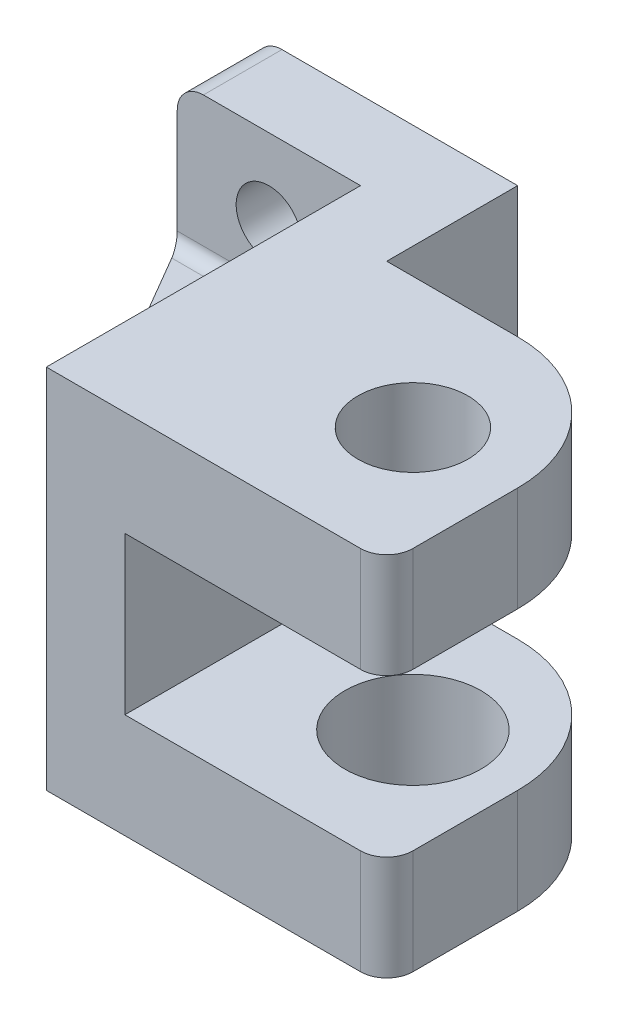
ISO-10303-21;
HEADER;
FILE_DESCRIPTION(('STEP AP214'),'2;1');
FILE_NAME('part.step','',(''),(''),'','','');
FILE_SCHEMA(('AUTOMOTIVE_DESIGN { 1 0 10303 214 1 1 1 1 }'));
ENDSEC;
DATA;
#1=APPLICATION_CONTEXT('core data for automotive mechanical design processes');
#2=APPLICATION_PROTOCOL_DEFINITION('international standard','automotive_design',2000,#1);
#3=PRODUCT_CONTEXT('',#1,'mechanical');
#4=PRODUCT('Part','Part','',(#3));
#5=PRODUCT_RELATED_PRODUCT_CATEGORY('part','',(#4));
#6=PRODUCT_DEFINITION_FORMATION('','',#4);
#7=PRODUCT_DEFINITION_CONTEXT('part definition',#1,'design');
#8=PRODUCT_DEFINITION('design','',#6,#7);
#9=PRODUCT_DEFINITION_SHAPE('','',#8);
#10=(LENGTH_UNIT() NAMED_UNIT(*) SI_UNIT(.MILLI.,.METRE.));
#11=(NAMED_UNIT(*) PLANE_ANGLE_UNIT() SI_UNIT($,.RADIAN.));
#12=(NAMED_UNIT(*) SI_UNIT($,.STERADIAN.) SOLID_ANGLE_UNIT());
#13=UNCERTAINTY_MEASURE_WITH_UNIT(LENGTH_MEASURE(1.E-05),#10,'distance_accuracy_value','');
#14=(GEOMETRIC_REPRESENTATION_CONTEXT(3) GLOBAL_UNCERTAINTY_ASSIGNED_CONTEXT((#13)) GLOBAL_UNIT_ASSIGNED_CONTEXT((#10,
#11,#12)) REPRESENTATION_CONTEXT('',''));
#15=CARTESIAN_POINT('',(0.,0.,0.));
#16=DIRECTION('',(0.,0.,1.));
#17=DIRECTION('',(1.,0.,0.));
#18=AXIS2_PLACEMENT_3D('',#15,#16,#17);
#19=CARTESIAN_POINT('',(-5.,7.,3.));
#20=DIRECTION('',(0.,-1.,0.));
#21=DIRECTION('',(0.,0.,-1.));
#22=AXIS2_PLACEMENT_3D('',#19,#20,#21);
#23=PLANE('',#22);
#24=DIRECTION('',(0.,0.,1.));
#25=VECTOR('',#24,1.);
#26=CARTESIAN_POINT('',(15.,7.,15.));
#27=LINE('',#26,#25);
#28=CARTESIAN_POINT('',(15.,7.,10.));
#29=VERTEX_POINT('',#28);
#30=CARTESIAN_POINT('',(15.,7.,14.));
#31=VERTEX_POINT('',#30);
#32=EDGE_CURVE('E579',#29,#31,#27,.T.);
#33=ORIENTED_EDGE('',*,*,#32,.F.);
#34=CARTESIAN_POINT('',(10.,7.,10.));
#35=DIRECTION('',(0.,-1.,0.));
#36=DIRECTION('',(0.,0.,-1.));
#37=AXIS2_PLACEMENT_3D('',#34,#35,#36);
#38=CIRCLE('',#37,5.);
#39=CARTESIAN_POINT('',(10.,7.,5.));
#40=VERTEX_POINT('',#39);
#41=EDGE_CURVE('E346',#29,#40,#38,.F.);
#42=ORIENTED_EDGE('',*,*,#41,.T.);
#43=DIRECTION('',(-1.,0.,0.));
#44=VECTOR('',#43,1.);
#45=CARTESIAN_POINT('',(15.,7.,5.));
#46=LINE('',#45,#44);
#47=CARTESIAN_POINT('',(5.,7.,5.));
#48=VERTEX_POINT('',#47);
#49=EDGE_CURVE('E583',#40,#48,#46,.T.);
#50=ORIENTED_EDGE('',*,*,#49,.T.);
#51=DIRECTION('',(0.,0.,-1.));
#52=VECTOR('',#51,1.);
#53=CARTESIAN_POINT('',(5.,7.,3.));
#54=LINE('',#53,#52);
#55=CARTESIAN_POINT('',(5.,7.,0.));
#56=VERTEX_POINT('',#55);
#57=EDGE_CURVE('E270',#48,#56,#54,.T.);
#58=ORIENTED_EDGE('',*,*,#57,.T.);
#59=DIRECTION('',(-1.,0.,0.));
#60=VECTOR('',#59,1.);
#61=CARTESIAN_POINT('',(-5.,7.,0.));
#62=LINE('',#61,#60);
#63=CARTESIAN_POINT('',(-4.,7.,0.));
#64=VERTEX_POINT('',#63);
#65=EDGE_CURVE('E261',#56,#64,#62,.T.);
#66=ORIENTED_EDGE('',*,*,#65,.T.);
#67=DIRECTION('',(0.,0.,-1.));
#68=VECTOR('',#67,1.);
#69=CARTESIAN_POINT('',(-4.,7.,3.));
#70=LINE('',#69,#68);
#71=CARTESIAN_POINT('',(-4.,7.,3.));
#72=VERTEX_POINT('',#71);
#73=EDGE_CURVE('E339',#64,#72,#70,.F.);
#74=ORIENTED_EDGE('',*,*,#73,.T.);
#75=DIRECTION('',(-1.,0.,0.));
#76=VECTOR('',#75,1.);
#77=CARTESIAN_POINT('',(-5.,7.,3.));
#78=LINE('',#77,#76);
#79=CARTESIAN_POINT('',(2.,7.,3.));
#80=VERTEX_POINT('',#79);
#81=EDGE_CURVE('E249',#80,#72,#78,.T.);
#82=ORIENTED_EDGE('',*,*,#81,.F.);
#83=DIRECTION('',(0.,0.,-1.));
#84=VECTOR('',#83,1.);
#85=CARTESIAN_POINT('',(2.,7.,15.));
#86=LINE('',#85,#84);
#87=CARTESIAN_POINT('',(2.,7.,15.));
#88=VERTEX_POINT('',#87);
#89=EDGE_CURVE('E245',#88,#80,#86,.T.);
#90=ORIENTED_EDGE('',*,*,#89,.F.);
#91=DIRECTION('',(-1.,0.,0.));
#92=VECTOR('',#91,1.);
#93=CARTESIAN_POINT('',(5.,7.,15.));
#94=LINE('',#93,#92);
#95=CARTESIAN_POINT('',(14.,7.,15.));
#96=VERTEX_POINT('',#95);
#97=EDGE_CURVE('E223',#96,#88,#94,.T.);
#98=ORIENTED_EDGE('',*,*,#97,.F.);
#99=CARTESIAN_POINT('',(14.,7.,14.));
#100=DIRECTION('',(0.,-1.,0.));
#101=DIRECTION('',(0.,0.,-1.));
#102=AXIS2_PLACEMENT_3D('',#99,#100,#101);
#103=CIRCLE('',#102,1.);
#104=EDGE_CURVE('E280',#96,#31,#103,.F.);
#105=ORIENTED_EDGE('',*,*,#104,.T.);
#106=EDGE_LOOP('',(#33,#42,#50,#58,#66,#74,#82,#90,#98,#105));
#107=FACE_BOUND('',#106,.T.);
#108=CARTESIAN_POINT('',(11.,7.,10.));
#109=DIRECTION('',(0.,1.,0.));
#110=DIRECTION('',(0.,0.,1.));
#111=AXIS2_PLACEMENT_3D('',#108,#109,#110);
#112=CIRCLE('',#111,2.09999999999999);
#113=CARTESIAN_POINT('',(11.,7.,12.1));
#114=VERTEX_POINT('',#113);
#115=EDGE_CURVE('E576',#114,#114,#112,.T.);
#116=ORIENTED_EDGE('',*,*,#115,.F.);
#117=EDGE_LOOP('',(#116));
#118=FACE_BOUND('',#117,.T.);
#119=ADVANCED_FACE('F36',(#107,#118),#23,.F.);
#120=CARTESIAN_POINT('',(5.,7.,3.));
#121=DIRECTION('',(-1.,0.,0.));
#122=DIRECTION('',(0.,-1.,0.));
#123=AXIS2_PLACEMENT_3D('',#120,#121,#122);
#124=PLANE('',#123);
#125=DIRECTION('',(0.,0.,-1.));
#126=VECTOR('',#125,1.);
#127=CARTESIAN_POINT('',(5.,3.,15.));
#128=LINE('',#127,#126);
#129=CARTESIAN_POINT('',(5.,3.,15.));
#130=VERTEX_POINT('',#129);
#131=CARTESIAN_POINT('',(5.,3.,5.));
#132=VERTEX_POINT('',#131);
#133=EDGE_CURVE('E199',#130,#132,#128,.T.);
#134=ORIENTED_EDGE('',*,*,#133,.F.);
#135=DIRECTION('',(0.,1.,0.));
#136=VECTOR('',#135,1.);
#137=CARTESIAN_POINT('',(5.,7.,15.));
#138=LINE('',#137,#136);
#139=CARTESIAN_POINT('',(5.,-3.,15.));
#140=VERTEX_POINT('',#139);
#141=EDGE_CURVE('E213',#140,#130,#138,.T.);
#142=ORIENTED_EDGE('',*,*,#141,.F.);
#143=DIRECTION('',(0.,0.,1.));
#144=VECTOR('',#143,1.);
#145=CARTESIAN_POINT('',(5.,-3.,15.));
#146=LINE('',#145,#144);
#147=CARTESIAN_POINT('',(5.,-3.,5.));
#148=VERTEX_POINT('',#147);
#149=EDGE_CURVE('E370',#148,#140,#146,.T.);
#150=ORIENTED_EDGE('',*,*,#149,.F.);
#151=DIRECTION('',(0.,1.,0.));
#152=VECTOR('',#151,1.);
#153=CARTESIAN_POINT('',(5.,-7.,5.));
#154=LINE('',#153,#152);
#155=CARTESIAN_POINT('',(5.,-7.,5.));
#156=VERTEX_POINT('',#155);
#157=EDGE_CURVE('E206',#156,#148,#154,.T.);
#158=ORIENTED_EDGE('',*,*,#157,.F.);
#159=DIRECTION('',(0.,0.,-1.));
#160=VECTOR('',#159,1.);
#161=CARTESIAN_POINT('',(5.,-7.,3.));
#162=LINE('',#161,#160);
#163=CARTESIAN_POINT('',(5.,-7.,0.));
#164=VERTEX_POINT('',#163);
#165=EDGE_CURVE('E258',#156,#164,#162,.T.);
#166=ORIENTED_EDGE('',*,*,#165,.T.);
#167=DIRECTION('',(0.,1.,0.));
#168=VECTOR('',#167,1.);
#169=CARTESIAN_POINT('',(5.,7.,0.));
#170=LINE('',#169,#168);
#171=EDGE_CURVE('E248',#164,#56,#170,.T.);
#172=ORIENTED_EDGE('',*,*,#171,.T.);
#173=ORIENTED_EDGE('',*,*,#57,.F.);
#174=DIRECTION('',(0.,1.,0.));
#175=VECTOR('',#174,1.);
#176=CARTESIAN_POINT('',(5.,7.,5.));
#177=LINE('',#176,#175);
#178=EDGE_CURVE('E217',#132,#48,#177,.T.);
#179=ORIENTED_EDGE('',*,*,#178,.F.);
#180=EDGE_LOOP('',(#134,#142,#150,#158,#166,#172,#173,#179));
#181=FACE_BOUND('',#180,.T.);
#182=ADVANCED_FACE('F211',(#181),#124,.F.);
#183=CARTESIAN_POINT('',(0.,0.,3.));
#184=DIRECTION('',(0.,0.,1.));
#185=DIRECTION('',(1.,0.,0.));
#186=AXIS2_PLACEMENT_3D('',#183,#184,#185);
#187=PLANE('',#186);
#188=CARTESIAN_POINT('',(-1.5,4.,3.));
#189=DIRECTION('',(0.,0.,1.));
#190=DIRECTION('',(1.,0.,0.));
#191=AXIS2_PLACEMENT_3D('',#188,#189,#190);
#192=CIRCLE('',#191,1.24999999999999);
#193=CARTESIAN_POINT('',(-0.250000000000012,4.,3.));
#194=VERTEX_POINT('',#193);
#195=EDGE_CURVE('E379',#194,#194,#192,.T.);
#196=ORIENTED_EDGE('',*,*,#195,.F.);
#197=EDGE_LOOP('',(#196));
#198=FACE_BOUND('',#197,.T.);
#199=ORIENTED_EDGE('',*,*,#81,.T.);
#200=CARTESIAN_POINT('',(-4.,6.,3.));
#201=DIRECTION('',(0.,0.,1.));
#202=DIRECTION('',(1.,0.,0.));
#203=AXIS2_PLACEMENT_3D('',#200,#201,#202);
#204=CIRCLE('',#203,1.);
#205=CARTESIAN_POINT('',(-5.,6.,3.));
#206=VERTEX_POINT('',#205);
#207=EDGE_CURVE('E341',#72,#206,#204,.T.);
#208=ORIENTED_EDGE('',*,*,#207,.T.);
#209=DIRECTION('',(0.,-1.,0.));
#210=VECTOR('',#209,1.);
#211=CARTESIAN_POINT('',(-5.,7.,3.));
#212=LINE('',#211,#210);
#213=CARTESIAN_POINT('',(-5.,2.,3.));
#214=VERTEX_POINT('',#213);
#215=EDGE_CURVE('E254',#206,#214,#212,.T.);
#216=ORIENTED_EDGE('',*,*,#215,.T.);
#217=DIRECTION('',(1.,0.,0.));
#218=VECTOR('',#217,1.);
#219=CARTESIAN_POINT('',(0.,2.,3.));
#220=LINE('',#219,#218);
#221=CARTESIAN_POINT('',(2.,2.,3.));
#222=VERTEX_POINT('',#221);
#223=EDGE_CURVE('E299',#214,#222,#220,.T.);
#224=ORIENTED_EDGE('',*,*,#223,.T.);
#225=DIRECTION('',(0.,-1.,0.));
#226=VECTOR('',#225,1.);
#227=CARTESIAN_POINT('',(2.,7.,3.));
#228=LINE('',#227,#226);
#229=EDGE_CURVE('E224',#80,#222,#228,.T.);
#230=ORIENTED_EDGE('',*,*,#229,.F.);
#231=EDGE_LOOP('',(#199,#208,#216,#224,#230));
#232=FACE_BOUND('',#231,.T.);
#233=ADVANCED_FACE('F448',(#198,#232),#187,.T.);
#234=CARTESIAN_POINT('',(2.,7.,15.));
#235=DIRECTION('',(1.,0.,0.));
#236=DIRECTION('',(0.,1.,0.));
#237=AXIS2_PLACEMENT_3D('',#234,#235,#236);
#238=PLANE('',#237);
#239=ORIENTED_EDGE('',*,*,#229,.T.);
#240=DIRECTION('',(0.,0.,-1.));
#241=VECTOR('',#240,1.);
#242=CARTESIAN_POINT('',(2.,2.,15.));
#243=LINE('',#242,#241);
#244=CARTESIAN_POINT('',(2.,2.,15.));
#245=VERTEX_POINT('',#244);
#246=EDGE_CURVE('E296',#222,#245,#243,.F.);
#247=ORIENTED_EDGE('',*,*,#246,.T.);
#248=DIRECTION('',(0.,-1.,0.));
#249=VECTOR('',#248,1.);
#250=CARTESIAN_POINT('',(2.,7.,15.));
#251=LINE('',#250,#249);
#252=EDGE_CURVE('E235',#88,#245,#251,.T.);
#253=ORIENTED_EDGE('',*,*,#252,.F.);
#254=ORIENTED_EDGE('',*,*,#89,.T.);
#255=EDGE_LOOP('',(#239,#247,#253,#254));
#256=FACE_BOUND('',#255,.T.);
#257=ADVANCED_FACE('F444',(#256),#238,.F.);
#258=CARTESIAN_POINT('',(-5.,7.,3.));
#259=DIRECTION('',(1.,0.,0.));
#260=DIRECTION('',(0.,1.,0.));
#261=AXIS2_PLACEMENT_3D('',#258,#259,#260);
#262=PLANE('',#261);
#263=DIRECTION('',(0.,-1.,0.));
#264=VECTOR('',#263,1.);
#265=CARTESIAN_POINT('',(-5.,7.,0.));
#266=LINE('',#265,#264);
#267=CARTESIAN_POINT('',(-5.,6.,0.));
#268=VERTEX_POINT('',#267);
#269=CARTESIAN_POINT('',(-5.,-6.,0.));
#270=VERTEX_POINT('',#269);
#271=EDGE_CURVE('E264',#268,#270,#266,.T.);
#272=ORIENTED_EDGE('',*,*,#271,.T.);
#273=DIRECTION('',(0.,0.,-1.));
#274=VECTOR('',#273,1.);
#275=CARTESIAN_POINT('',(-5.,-6.,3.));
#276=LINE('',#275,#274);
#277=CARTESIAN_POINT('',(-5.,-6.,3.));
#278=VERTEX_POINT('',#277);
#279=EDGE_CURVE('E335',#270,#278,#276,.F.);
#280=ORIENTED_EDGE('',*,*,#279,.T.);
#281=CARTESIAN_POINT('',(-5.,-2.,3.));
#282=VERTEX_POINT('',#281);
#283=EDGE_CURVE('E252',#282,#278,#212,.T.);
#284=ORIENTED_EDGE('',*,*,#283,.F.);
#285=DIRECTION('',(0.,1.,0.));
#286=VECTOR('',#285,1.);
#287=CARTESIAN_POINT('',(-5.,0.,3.));
#288=LINE('',#287,#286);
#289=EDGE_CURVE('E232',#214,#282,#288,.F.);
#290=ORIENTED_EDGE('',*,*,#289,.F.);
#291=ORIENTED_EDGE('',*,*,#215,.F.);
#292=DIRECTION('',(0.,0.,-1.));
#293=VECTOR('',#292,1.);
#294=CARTESIAN_POINT('',(-5.,6.,3.));
#295=LINE('',#294,#293);
#296=EDGE_CURVE('E332',#206,#268,#295,.T.);
#297=ORIENTED_EDGE('',*,*,#296,.T.);
#298=EDGE_LOOP('',(#272,#280,#284,#290,#291,#297));
#299=FACE_BOUND('',#298,.T.);
#300=ADVANCED_FACE('F426',(#299),#262,.F.);
#301=CARTESIAN_POINT('',(-5.,-7.,3.));
#302=DIRECTION('',(0.,1.,0.));
#303=DIRECTION('',(0.,0.,1.));
#304=AXIS2_PLACEMENT_3D('',#301,#302,#303);
#305=PLANE('',#304);
#306=CARTESIAN_POINT('',(11.,-7.,10.));
#307=DIRECTION('',(0.,-1.,0.));
#308=DIRECTION('',(0.,0.,-1.));
#309=AXIS2_PLACEMENT_3D('',#306,#307,#308);
#310=CIRCLE('',#309,2.6);
#311=CARTESIAN_POINT('',(11.,-7.,7.4));
#312=VERTEX_POINT('',#311);
#313=EDGE_CURVE('E570',#312,#312,#310,.T.);
#314=ORIENTED_EDGE('',*,*,#313,.F.);
#315=EDGE_LOOP('',(#314));
#316=FACE_BOUND('',#315,.T.);
#317=DIRECTION('',(-1.,0.,0.));
#318=VECTOR('',#317,1.);
#319=CARTESIAN_POINT('',(15.,-7.,5.));
#320=LINE('',#319,#318);
#321=CARTESIAN_POINT('',(10.,-7.,5.));
#322=VERTEX_POINT('',#321);
#323=EDGE_CURVE('E377',#322,#156,#320,.T.);
#324=ORIENTED_EDGE('',*,*,#323,.F.);
#325=CARTESIAN_POINT('',(10.,-7.,10.));
#326=DIRECTION('',(0.,1.,0.));
#327=DIRECTION('',(0.,0.,1.));
#328=AXIS2_PLACEMENT_3D('',#325,#326,#327);
#329=CIRCLE('',#328,5.);
#330=CARTESIAN_POINT('',(15.,-7.,10.));
#331=VERTEX_POINT('',#330);
#332=EDGE_CURVE('E11',#322,#331,#329,.F.);
#333=ORIENTED_EDGE('',*,*,#332,.T.);
#334=DIRECTION('',(0.,0.,-1.));
#335=VECTOR('',#334,1.);
#336=CARTESIAN_POINT('',(15.,-7.,15.));
#337=LINE('',#336,#335);
#338=CARTESIAN_POINT('',(15.,-7.,14.));
#339=VERTEX_POINT('',#338);
#340=EDGE_CURVE('E361',#339,#331,#337,.T.);
#341=ORIENTED_EDGE('',*,*,#340,.F.);
#342=CARTESIAN_POINT('',(14.,-7.,14.));
#343=DIRECTION('',(0.,1.,0.));
#344=DIRECTION('',(0.,0.,1.));
#345=AXIS2_PLACEMENT_3D('',#342,#343,#344);
#346=CIRCLE('',#345,1.);
#347=CARTESIAN_POINT('',(14.,-7.,15.));
#348=VERTEX_POINT('',#347);
#349=EDGE_CURVE('E286',#339,#348,#346,.F.);
#350=ORIENTED_EDGE('',*,*,#349,.T.);
#351=DIRECTION('',(1.,0.,0.));
#352=VECTOR('',#351,1.);
#353=CARTESIAN_POINT('',(5.,-7.,15.));
#354=LINE('',#353,#352);
#355=CARTESIAN_POINT('',(2.,-7.,15.));
#356=VERTEX_POINT('',#355);
#357=EDGE_CURVE('E238',#356,#348,#354,.T.);
#358=ORIENTED_EDGE('',*,*,#357,.F.);
#359=DIRECTION('',(0.,0.,-1.));
#360=VECTOR('',#359,1.);
#361=CARTESIAN_POINT('',(2.,-7.,15.));
#362=LINE('',#361,#360);
#363=CARTESIAN_POINT('',(2.,-7.,3.));
#364=VERTEX_POINT('',#363);
#365=EDGE_CURVE('E241',#356,#364,#362,.T.);
#366=ORIENTED_EDGE('',*,*,#365,.T.);
#367=DIRECTION('',(1.,0.,0.));
#368=VECTOR('',#367,1.);
#369=CARTESIAN_POINT('',(-5.,-7.,3.));
#370=LINE('',#369,#368);
#371=CARTESIAN_POINT('',(-4.,-7.,3.));
#372=VERTEX_POINT('',#371);
#373=EDGE_CURVE('E256',#372,#364,#370,.T.);
#374=ORIENTED_EDGE('',*,*,#373,.F.);
#375=DIRECTION('',(0.,0.,-1.));
#376=VECTOR('',#375,1.);
#377=CARTESIAN_POINT('',(-4.,-7.,3.));
#378=LINE('',#377,#376);
#379=CARTESIAN_POINT('',(-4.,-7.,0.));
#380=VERTEX_POINT('',#379);
#381=EDGE_CURVE('E321',#372,#380,#378,.T.);
#382=ORIENTED_EDGE('',*,*,#381,.T.);
#383=DIRECTION('',(1.,0.,0.));
#384=VECTOR('',#383,1.);
#385=CARTESIAN_POINT('',(-5.,-7.,0.));
#386=LINE('',#385,#384);
#387=EDGE_CURVE('E253',#380,#164,#386,.T.);
#388=ORIENTED_EDGE('',*,*,#387,.T.);
#389=ORIENTED_EDGE('',*,*,#165,.F.);
#390=EDGE_LOOP('',(#324,#333,#341,#350,#358,#366,#374,#382,#388,#389));
#391=FACE_BOUND('',#390,.T.);
#392=ADVANCED_FACE('F469',(#316,#391),#305,.F.);
#393=CARTESIAN_POINT('',(-1.5,-4.,3.));
#394=DIRECTION('',(0.,0.,1.));
#395=DIRECTION('',(1.,0.,0.));
#396=AXIS2_PLACEMENT_3D('',#393,#394,#395);
#397=CIRCLE('',#396,1.24999999999999);
#398=CARTESIAN_POINT('',(-0.250000000000012,-4.,3.));
#399=VERTEX_POINT('',#398);
#400=EDGE_CURVE('E385',#399,#399,#397,.T.);
#401=ORIENTED_EDGE('',*,*,#400,.F.);
#402=EDGE_LOOP('',(#401));
#403=FACE_BOUND('',#402,.T.);
#404=ORIENTED_EDGE('',*,*,#283,.T.);
#405=CARTESIAN_POINT('',(-4.,-6.,3.));
#406=DIRECTION('',(0.,0.,1.));
#407=DIRECTION('',(1.,0.,0.));
#408=AXIS2_PLACEMENT_3D('',#405,#406,#407);
#409=CIRCLE('',#408,1.);
#410=EDGE_CURVE('E337',#278,#372,#409,.T.);
#411=ORIENTED_EDGE('',*,*,#410,.T.);
#412=ORIENTED_EDGE('',*,*,#373,.T.);
#413=CARTESIAN_POINT('',(2.,-2.,3.));
#414=VERTEX_POINT('',#413);
#415=EDGE_CURVE('E229',#414,#364,#228,.T.);
#416=ORIENTED_EDGE('',*,*,#415,.F.);
#417=DIRECTION('',(1.,0.,0.));
#418=VECTOR('',#417,1.);
#419=CARTESIAN_POINT('',(-5.,-2.,3.));
#420=LINE('',#419,#418);
#421=EDGE_CURVE('E306',#414,#282,#420,.F.);
#422=ORIENTED_EDGE('',*,*,#421,.T.);
#423=EDGE_LOOP('',(#404,#411,#412,#416,#422));
#424=FACE_BOUND('',#423,.T.);
#425=ADVANCED_FACE('F421',(#403,#424),#187,.T.);
#426=CARTESIAN_POINT('',(0.,0.,0.));
#427=DIRECTION('',(0.,0.,1.));
#428=DIRECTION('',(1.,0.,0.));
#429=AXIS2_PLACEMENT_3D('',#426,#427,#428);
#430=PLANE('',#429);
#431=CARTESIAN_POINT('',(-1.5,4.,0.));
#432=DIRECTION('',(0.,0.,1.));
#433=DIRECTION('',(1.,0.,0.));
#434=AXIS2_PLACEMENT_3D('',#431,#432,#433);
#435=CIRCLE('',#434,1.24999999999999);
#436=CARTESIAN_POINT('',(-0.250000000000006,4.,0.));
#437=VERTEX_POINT('',#436);
#438=EDGE_CURVE('E382',#437,#437,#435,.T.);
#439=ORIENTED_EDGE('',*,*,#438,.T.);
#440=EDGE_LOOP('',(#439));
#441=FACE_BOUND('',#440,.T.);
#442=CARTESIAN_POINT('',(-1.5,-4.,0.));
#443=DIRECTION('',(0.,0.,1.));
#444=DIRECTION('',(1.,0.,0.));
#445=AXIS2_PLACEMENT_3D('',#442,#443,#444);
#446=CIRCLE('',#445,1.24999999999999);
#447=CARTESIAN_POINT('',(-0.250000000000006,-4.,0.));
#448=VERTEX_POINT('',#447);
#449=EDGE_CURVE('E388',#448,#448,#446,.T.);
#450=ORIENTED_EDGE('',*,*,#449,.T.);
#451=EDGE_LOOP('',(#450));
#452=FACE_BOUND('',#451,.T.);
#453=ORIENTED_EDGE('',*,*,#387,.F.);
#454=CARTESIAN_POINT('',(-4.,-6.,0.));
#455=DIRECTION('',(0.,0.,1.));
#456=DIRECTION('',(1.,0.,0.));
#457=AXIS2_PLACEMENT_3D('',#454,#455,#456);
#458=CIRCLE('',#457,1.);
#459=EDGE_CURVE('E330',#380,#270,#458,.F.);
#460=ORIENTED_EDGE('',*,*,#459,.T.);
#461=ORIENTED_EDGE('',*,*,#271,.F.);
#462=CARTESIAN_POINT('',(-4.,6.,0.));
#463=DIRECTION('',(0.,0.,1.));
#464=DIRECTION('',(1.,0.,0.));
#465=AXIS2_PLACEMENT_3D('',#462,#463,#464);
#466=CIRCLE('',#465,1.);
#467=EDGE_CURVE('E328',#268,#64,#466,.F.);
#468=ORIENTED_EDGE('',*,*,#467,.T.);
#469=ORIENTED_EDGE('',*,*,#65,.F.);
#470=ORIENTED_EDGE('',*,*,#171,.F.);
#471=EDGE_LOOP('',(#453,#460,#461,#468,#469,#470));
#472=FACE_BOUND('',#471,.T.);
#473=ADVANCED_FACE('F462',(#441,#452,#472),#430,.F.);
#474=CARTESIAN_POINT('',(2.,-2.,15.));
#475=VERTEX_POINT('',#474);
#476=EDGE_CURVE('E226',#475,#356,#251,.T.);
#477=ORIENTED_EDGE('',*,*,#476,.F.);
#478=DIRECTION('',(0.,0.,-1.));
#479=VECTOR('',#478,1.);
#480=CARTESIAN_POINT('',(2.,-2.,15.));
#481=LINE('',#480,#479);
#482=EDGE_CURVE('E309',#475,#414,#481,.T.);
#483=ORIENTED_EDGE('',*,*,#482,.T.);
#484=ORIENTED_EDGE('',*,*,#415,.T.);
#485=ORIENTED_EDGE('',*,*,#365,.F.);
#486=EDGE_LOOP('',(#477,#483,#484,#485));
#487=FACE_BOUND('',#486,.T.);
#488=ADVANCED_FACE('F439',(#487),#238,.F.);
#489=CARTESIAN_POINT('',(0.,0.,15.));
#490=DIRECTION('',(0.,0.,-1.));
#491=DIRECTION('',(-1.,0.,0.));
#492=AXIS2_PLACEMENT_3D('',#489,#490,#491);
#493=PLANE('',#492);
#494=DIRECTION('',(-1.,0.,0.));
#495=VECTOR('',#494,1.);
#496=CARTESIAN_POINT('',(15.,3.,15.));
#497=LINE('',#496,#495);
#498=CARTESIAN_POINT('',(14.,3.,15.));
#499=VERTEX_POINT('',#498);
#500=EDGE_CURVE('E195',#499,#130,#497,.T.);
#501=ORIENTED_EDGE('',*,*,#500,.F.);
#502=DIRECTION('',(0.,-1.,0.));
#503=VECTOR('',#502,1.);
#504=CARTESIAN_POINT('',(14.,0.,15.));
#505=LINE('',#504,#503);
#506=EDGE_CURVE('E278',#499,#96,#505,.F.);
#507=ORIENTED_EDGE('',*,*,#506,.T.);
#508=ORIENTED_EDGE('',*,*,#97,.T.);
#509=ORIENTED_EDGE('',*,*,#252,.T.);
#510=EDGE_CURVE('E239',#245,#475,#251,.T.);
#511=ORIENTED_EDGE('',*,*,#510,.T.);
#512=ORIENTED_EDGE('',*,*,#476,.T.);
#513=ORIENTED_EDGE('',*,*,#357,.T.);
#514=DIRECTION('',(0.,-1.,0.));
#515=VECTOR('',#514,1.);
#516=CARTESIAN_POINT('',(14.,0.,15.));
#517=LINE('',#516,#515);
#518=CARTESIAN_POINT('',(14.,-3.,15.));
#519=VERTEX_POINT('',#518);
#520=EDGE_CURVE('E276',#348,#519,#517,.F.);
#521=ORIENTED_EDGE('',*,*,#520,.T.);
#522=DIRECTION('',(-1.,0.,0.));
#523=VECTOR('',#522,1.);
#524=CARTESIAN_POINT('',(15.,-3.,15.));
#525=LINE('',#524,#523);
#526=EDGE_CURVE('E222',#519,#140,#525,.T.);
#527=ORIENTED_EDGE('',*,*,#526,.T.);
#528=ORIENTED_EDGE('',*,*,#141,.T.);
#529=EDGE_LOOP('',(#501,#507,#508,#509,#511,#512,#513,#521,#527,#528));
#530=FACE_BOUND('',#529,.T.);
#531=ADVANCED_FACE('F220',(#530),#493,.F.);
#532=CARTESIAN_POINT('',(-5.,0.,3.));
#533=DIRECTION('',(0.863778900898433,0.,-0.503871025524086));
#534=DIRECTION('',(0.503871025524086,0.,0.863778900898433));
#535=AXIS2_PLACEMENT_3D('',#532,#533,#534);
#536=PLANE('',#535);
#537=DIRECTION('',(0.503871025524086,0.,0.863778900898433));
#538=VECTOR('',#537,1.);
#539=CARTESIAN_POINT('',(-5.,1.5,3.));
#540=LINE('',#539,#538);
#541=CARTESIAN_POINT('',(-4.70833333333333,1.5,3.5));
#542=VERTEX_POINT('',#541);
#543=CARTESIAN_POINT('',(1.5,1.5,14.1428571428571));
#544=VERTEX_POINT('',#543);
#545=EDGE_CURVE('E391',#542,#544,#540,.T.);
#546=ORIENTED_EDGE('',*,*,#545,.F.);
#547=CARTESIAN_POINT('',(-4.70833333333333,2.,3.5));
#548=DIRECTION('',(0.863778900898433,0.,-0.503871025524086));
#549=DIRECTION('',(0.503871025524086,0.,0.863778900898433));
#550=AXIS2_PLACEMENT_3D('',#547,#548,#549);
#551=ELLIPSE('',#550,0.578851832893742,0.5);
#552=EDGE_CURVE('E313',#542,#214,#551,.T.);
#553=ORIENTED_EDGE('',*,*,#552,.T.);
#554=ORIENTED_EDGE('',*,*,#289,.T.);
#555=CARTESIAN_POINT('',(-4.70833333333333,-2.,3.5));
#556=DIRECTION('',(0.863778900898433,0.,-0.503871025524086));
#557=DIRECTION('',(-0.503871025524086,0.,-0.863778900898433));
#558=AXIS2_PLACEMENT_3D('',#555,#556,#557);
#559=ELLIPSE('',#558,0.578851832893742,0.5);
#560=CARTESIAN_POINT('',(-4.70833333333333,-1.5,3.5));
#561=VERTEX_POINT('',#560);
#562=EDGE_CURVE('E316',#282,#561,#559,.T.);
#563=ORIENTED_EDGE('',*,*,#562,.T.);
#564=DIRECTION('',(0.503871025524086,0.,0.863778900898433));
#565=VECTOR('',#564,1.);
#566=CARTESIAN_POINT('',(-5.,-1.5,3.));
#567=LINE('',#566,#565);
#568=CARTESIAN_POINT('',(1.5,-1.5,14.1428571428571));
#569=VERTEX_POINT('',#568);
#570=EDGE_CURVE('E392',#561,#569,#567,.T.);
#571=ORIENTED_EDGE('',*,*,#570,.T.);
#572=CARTESIAN_POINT('',(1.5,-2.,14.1428571428571));
#573=DIRECTION('',(0.863778900898433,0.,-0.503871025524086));
#574=DIRECTION('',(-0.503871025524086,0.,-0.863778900898433));
#575=AXIS2_PLACEMENT_3D('',#572,#573,#574);
#576=ELLIPSE('',#575,0.992317427817843,0.5);
#577=EDGE_CURVE('E318',#569,#475,#576,.T.);
#578=ORIENTED_EDGE('',*,*,#577,.T.);
#579=ORIENTED_EDGE('',*,*,#510,.F.);
#580=CARTESIAN_POINT('',(1.5,2.,14.1428571428571));
#581=DIRECTION('',(0.863778900898433,0.,-0.503871025524086));
#582=DIRECTION('',(0.503871025524086,0.,0.863778900898433));
#583=AXIS2_PLACEMENT_3D('',#580,#581,#582);
#584=ELLIPSE('',#583,0.992317427817843,0.5);
#585=EDGE_CURVE('E311',#245,#544,#584,.T.);
#586=ORIENTED_EDGE('',*,*,#585,.T.);
#587=EDGE_LOOP('',(#546,#553,#554,#563,#571,#578,#579,#586));
#588=FACE_BOUND('',#587,.T.);
#589=ADVANCED_FACE('F410',(#588),#536,.F.);
#590=CARTESIAN_POINT('',(0.,-1.5,7.5));
#591=DIRECTION('',(0.,-1.,0.));
#592=DIRECTION('',(0.,0.,-1.));
#593=AXIS2_PLACEMENT_3D('',#590,#591,#592);
#594=PLANE('',#593);
#595=ORIENTED_EDGE('',*,*,#570,.F.);
#596=DIRECTION('',(1.,0.,0.));
#597=VECTOR('',#596,1.);
#598=CARTESIAN_POINT('',(2.,-1.5,3.5));
#599=LINE('',#598,#597);
#600=CARTESIAN_POINT('',(1.5,-1.5,3.5));
#601=VERTEX_POINT('',#600);
#602=EDGE_CURVE('E303',#561,#601,#599,.T.);
#603=ORIENTED_EDGE('',*,*,#602,.T.);
#604=DIRECTION('',(0.,0.,-1.));
#605=VECTOR('',#604,1.);
#606=CARTESIAN_POINT('',(1.5,-1.5,7.5));
#607=LINE('',#606,#605);
#608=EDGE_CURVE('E301',#601,#569,#607,.F.);
#609=ORIENTED_EDGE('',*,*,#608,.T.);
#610=EDGE_LOOP('',(#595,#603,#609));
#611=FACE_BOUND('',#610,.T.);
#612=ADVANCED_FACE('F432',(#611),#594,.T.);
#613=CARTESIAN_POINT('',(0.,1.5,7.5));
#614=DIRECTION('',(0.,-1.,0.));
#615=DIRECTION('',(0.,0.,-1.));
#616=AXIS2_PLACEMENT_3D('',#613,#614,#615);
#617=PLANE('',#616);
#618=ORIENTED_EDGE('',*,*,#545,.T.);
#619=DIRECTION('',(0.,0.,-1.));
#620=VECTOR('',#619,1.);
#621=CARTESIAN_POINT('',(1.5,1.5,3.));
#622=LINE('',#621,#620);
#623=CARTESIAN_POINT('',(1.5,1.5,3.5));
#624=VERTEX_POINT('',#623);
#625=EDGE_CURVE('E293',#544,#624,#622,.T.);
#626=ORIENTED_EDGE('',*,*,#625,.T.);
#627=DIRECTION('',(1.,0.,0.));
#628=VECTOR('',#627,1.);
#629=CARTESIAN_POINT('',(0.,1.5,3.5));
#630=LINE('',#629,#628);
#631=EDGE_CURVE('E291',#624,#542,#630,.F.);
#632=ORIENTED_EDGE('',*,*,#631,.T.);
#633=EDGE_LOOP('',(#618,#626,#632));
#634=FACE_BOUND('',#633,.T.);
#635=ADVANCED_FACE('F398',(#634),#617,.F.);
#636=CARTESIAN_POINT('',(-1.5,-4.,3.));
#637=DIRECTION('',(0.,0.,1.));
#638=DIRECTION('',(1.,0.,0.));
#639=AXIS2_PLACEMENT_3D('',#636,#637,#638);
#640=CYLINDRICAL_SURFACE('',#639,1.24999999999999);
#641=ORIENTED_EDGE('',*,*,#449,.F.);
#642=EDGE_LOOP('',(#641));
#643=FACE_BOUND('',#642,.T.);
#644=ORIENTED_EDGE('',*,*,#400,.T.);
#645=EDGE_LOOP('',(#644));
#646=FACE_BOUND('',#645,.T.);
#647=ADVANCED_FACE('F543',(#643,#646),#640,.F.);
#648=CARTESIAN_POINT('',(-1.5,4.,3.));
#649=DIRECTION('',(0.,0.,1.));
#650=DIRECTION('',(1.,0.,0.));
#651=AXIS2_PLACEMENT_3D('',#648,#649,#650);
#652=CYLINDRICAL_SURFACE('',#651,1.24999999999999);
#653=ORIENTED_EDGE('',*,*,#438,.F.);
#654=EDGE_LOOP('',(#653));
#655=FACE_BOUND('',#654,.T.);
#656=ORIENTED_EDGE('',*,*,#195,.T.);
#657=EDGE_LOOP('',(#656));
#658=FACE_BOUND('',#657,.T.);
#659=ADVANCED_FACE('F540',(#655,#658),#652,.F.);
#660=CARTESIAN_POINT('',(15.,-7.,5.));
#661=DIRECTION('',(0.,0.,1.));
#662=DIRECTION('',(1.,0.,0.));
#663=AXIS2_PLACEMENT_3D('',#660,#661,#662);
#664=PLANE('',#663);
#665=DIRECTION('',(-1.,0.,0.));
#666=VECTOR('',#665,1.);
#667=CARTESIAN_POINT('',(15.,-3.,5.));
#668=LINE('',#667,#666);
#669=CARTESIAN_POINT('',(10.,-3.,5.));
#670=VERTEX_POINT('',#669);
#671=EDGE_CURVE('E368',#670,#148,#668,.T.);
#672=ORIENTED_EDGE('',*,*,#671,.F.);
#673=DIRECTION('',(0.,1.,0.));
#674=VECTOR('',#673,1.);
#675=CARTESIAN_POINT('',(10.,-7.,5.));
#676=LINE('',#675,#674);
#677=EDGE_CURVE('E44',#670,#322,#676,.F.);
#678=ORIENTED_EDGE('',*,*,#677,.T.);
#679=ORIENTED_EDGE('',*,*,#323,.T.);
#680=ORIENTED_EDGE('',*,*,#157,.T.);
#681=EDGE_LOOP('',(#672,#678,#679,#680));
#682=FACE_BOUND('',#681,.T.);
#683=ADVANCED_FACE('F536',(#682),#664,.F.);
#684=CARTESIAN_POINT('',(15.,-3.,15.));
#685=DIRECTION('',(0.,-1.,0.));
#686=DIRECTION('',(1.,0.,0.));
#687=AXIS2_PLACEMENT_3D('',#684,#685,#686);
#688=PLANE('',#687);
#689=CARTESIAN_POINT('',(11.,-3.,10.));
#690=DIRECTION('',(0.,-1.,0.));
#691=DIRECTION('',(0.,0.,-1.));
#692=AXIS2_PLACEMENT_3D('',#689,#690,#691);
#693=CIRCLE('',#692,2.6);
#694=CARTESIAN_POINT('',(11.,-3.,7.4));
#695=VERTEX_POINT('',#694);
#696=EDGE_CURVE('E325',#695,#695,#693,.T.);
#697=ORIENTED_EDGE('',*,*,#696,.T.);
#698=EDGE_LOOP('',(#697));
#699=FACE_BOUND('',#698,.T.);
#700=DIRECTION('',(0.,0.,1.));
#701=VECTOR('',#700,1.);
#702=CARTESIAN_POINT('',(15.,-3.,15.));
#703=LINE('',#702,#701);
#704=CARTESIAN_POINT('',(15.,-3.,10.));
#705=VERTEX_POINT('',#704);
#706=CARTESIAN_POINT('',(15.,-3.,14.));
#707=VERTEX_POINT('',#706);
#708=EDGE_CURVE('E359',#705,#707,#703,.T.);
#709=ORIENTED_EDGE('',*,*,#708,.F.);
#710=CARTESIAN_POINT('',(10.,-3.,10.));
#711=DIRECTION('',(0.,-1.,0.));
#712=DIRECTION('',(1.,0.,0.));
#713=AXIS2_PLACEMENT_3D('',#710,#711,#712);
#714=CIRCLE('',#713,5.);
#715=EDGE_CURVE('E58',#705,#670,#714,.F.);
#716=ORIENTED_EDGE('',*,*,#715,.T.);
#717=ORIENTED_EDGE('',*,*,#671,.T.);
#718=ORIENTED_EDGE('',*,*,#149,.T.);
#719=ORIENTED_EDGE('',*,*,#526,.F.);
#720=CARTESIAN_POINT('',(14.,-3.,14.));
#721=DIRECTION('',(0.,-1.,0.));
#722=DIRECTION('',(1.,0.,0.));
#723=AXIS2_PLACEMENT_3D('',#720,#721,#722);
#724=CIRCLE('',#723,1.);
#725=EDGE_CURVE('E288',#519,#707,#724,.F.);
#726=ORIENTED_EDGE('',*,*,#725,.T.);
#727=EDGE_LOOP('',(#709,#716,#717,#718,#719,#726));
#728=FACE_BOUND('',#727,.T.);
#729=ADVANCED_FACE('F364',(#699,#728),#688,.F.);
#730=CARTESIAN_POINT('',(15.,0.,0.));
#731=DIRECTION('',(-1.,0.,0.));
#732=DIRECTION('',(0.,-1.,0.));
#733=AXIS2_PLACEMENT_3D('',#730,#731,#732);
#734=PLANE('',#733);
#735=ORIENTED_EDGE('',*,*,#340,.T.);
#736=DIRECTION('',(0.,1.,0.));
#737=VECTOR('',#736,1.);
#738=CARTESIAN_POINT('',(15.,0.,10.));
#739=LINE('',#738,#737);
#740=EDGE_CURVE('E352',#331,#705,#739,.T.);
#741=ORIENTED_EDGE('',*,*,#740,.T.);
#742=ORIENTED_EDGE('',*,*,#708,.T.);
#743=DIRECTION('',(0.,-1.,0.));
#744=VECTOR('',#743,1.);
#745=CARTESIAN_POINT('',(15.,0.,14.));
#746=LINE('',#745,#744);
#747=EDGE_CURVE('E283',#707,#339,#746,.T.);
#748=ORIENTED_EDGE('',*,*,#747,.T.);
#749=EDGE_LOOP('',(#735,#741,#742,#748));
#750=FACE_BOUND('',#749,.T.);
#751=ADVANCED_FACE('F358',(#750),#734,.F.);
#752=CARTESIAN_POINT('',(15.,3.,15.));
#753=DIRECTION('',(0.,1.,0.));
#754=DIRECTION('',(-1.,0.,0.));
#755=AXIS2_PLACEMENT_3D('',#752,#753,#754);
#756=PLANE('',#755);
#757=CARTESIAN_POINT('',(11.,3.,10.));
#758=DIRECTION('',(0.,1.,0.));
#759=DIRECTION('',(-1.,0.,0.));
#760=AXIS2_PLACEMENT_3D('',#757,#758,#759);
#761=CIRCLE('',#760,2.09999999999999);
#762=CARTESIAN_POINT('',(8.90000000000001,3.,10.));
#763=VERTEX_POINT('',#762);
#764=EDGE_CURVE('E571',#763,#763,#761,.T.);
#765=ORIENTED_EDGE('',*,*,#764,.T.);
#766=EDGE_LOOP('',(#765));
#767=FACE_BOUND('',#766,.T.);
#768=DIRECTION('',(-1.,0.,0.));
#769=VECTOR('',#768,1.);
#770=CARTESIAN_POINT('',(15.,3.,5.));
#771=LINE('',#770,#769);
#772=CARTESIAN_POINT('',(10.,3.,5.));
#773=VERTEX_POINT('',#772);
#774=EDGE_CURVE('E207',#773,#132,#771,.T.);
#775=ORIENTED_EDGE('',*,*,#774,.F.);
#776=CARTESIAN_POINT('',(10.,3.,10.));
#777=DIRECTION('',(0.,1.,0.));
#778=DIRECTION('',(-1.,0.,0.));
#779=AXIS2_PLACEMENT_3D('',#776,#777,#778);
#780=CIRCLE('',#779,5.);
#781=CARTESIAN_POINT('',(15.,3.,10.));
#782=VERTEX_POINT('',#781);
#783=EDGE_CURVE('E350',#773,#782,#780,.F.);
#784=ORIENTED_EDGE('',*,*,#783,.T.);
#785=DIRECTION('',(0.,0.,-1.));
#786=VECTOR('',#785,1.);
#787=CARTESIAN_POINT('',(15.,3.,15.));
#788=LINE('',#787,#786);
#789=CARTESIAN_POINT('',(15.,3.,14.));
#790=VERTEX_POINT('',#789);
#791=EDGE_CURVE('E581',#790,#782,#788,.T.);
#792=ORIENTED_EDGE('',*,*,#791,.F.);
#793=CARTESIAN_POINT('',(14.,3.,14.));
#794=DIRECTION('',(0.,1.,0.));
#795=DIRECTION('',(-1.,0.,0.));
#796=AXIS2_PLACEMENT_3D('',#793,#794,#795);
#797=CIRCLE('',#796,1.);
#798=EDGE_CURVE('E202',#790,#499,#797,.F.);
#799=ORIENTED_EDGE('',*,*,#798,.T.);
#800=ORIENTED_EDGE('',*,*,#500,.T.);
#801=ORIENTED_EDGE('',*,*,#133,.T.);
#802=EDGE_LOOP('',(#775,#784,#792,#799,#800,#801));
#803=FACE_BOUND('',#802,.T.);
#804=ADVANCED_FACE('F198',(#767,#803),#756,.F.);
#805=CARTESIAN_POINT('',(15.,7.,5.));
#806=DIRECTION('',(0.,0.,1.));
#807=DIRECTION('',(1.,0.,0.));
#808=AXIS2_PLACEMENT_3D('',#805,#806,#807);
#809=PLANE('',#808);
#810=ORIENTED_EDGE('',*,*,#49,.F.);
#811=DIRECTION('',(0.,1.,0.));
#812=VECTOR('',#811,1.);
#813=CARTESIAN_POINT('',(10.,7.,5.));
#814=LINE('',#813,#812);
#815=EDGE_CURVE('E348',#40,#773,#814,.F.);
#816=ORIENTED_EDGE('',*,*,#815,.T.);
#817=ORIENTED_EDGE('',*,*,#774,.T.);
#818=ORIENTED_EDGE('',*,*,#178,.T.);
#819=EDGE_LOOP('',(#810,#816,#817,#818));
#820=FACE_BOUND('',#819,.T.);
#821=ADVANCED_FACE('F524',(#820),#809,.F.);
#822=CARTESIAN_POINT('',(15.,0.,0.));
#823=DIRECTION('',(-1.,0.,0.));
#824=DIRECTION('',(0.,-1.,0.));
#825=AXIS2_PLACEMENT_3D('',#822,#823,#824);
#826=PLANE('',#825);
#827=ORIENTED_EDGE('',*,*,#791,.T.);
#828=DIRECTION('',(0.,1.,0.));
#829=VECTOR('',#828,1.);
#830=CARTESIAN_POINT('',(15.,0.,10.));
#831=LINE('',#830,#829);
#832=EDGE_CURVE('E343',#782,#29,#831,.T.);
#833=ORIENTED_EDGE('',*,*,#832,.T.);
#834=ORIENTED_EDGE('',*,*,#32,.T.);
#835=DIRECTION('',(0.,-1.,0.));
#836=VECTOR('',#835,1.);
#837=CARTESIAN_POINT('',(15.,0.,14.));
#838=LINE('',#837,#836);
#839=EDGE_CURVE('E272',#31,#790,#838,.T.);
#840=ORIENTED_EDGE('',*,*,#839,.T.);
#841=EDGE_LOOP('',(#827,#833,#834,#840));
#842=FACE_BOUND('',#841,.T.);
#843=ADVANCED_FACE('F493',(#842),#826,.F.);
#844=CARTESIAN_POINT('',(14.,0.,14.));
#845=DIRECTION('',(0.,-1.,0.));
#846=DIRECTION('',(1.,0.,0.));
#847=AXIS2_PLACEMENT_3D('',#844,#845,#846);
#848=CYLINDRICAL_SURFACE('',#847,1.);
#849=ORIENTED_EDGE('',*,*,#104,.F.);
#850=ORIENTED_EDGE('',*,*,#506,.F.);
#851=ORIENTED_EDGE('',*,*,#798,.F.);
#852=ORIENTED_EDGE('',*,*,#839,.F.);
#853=EDGE_LOOP('',(#849,#850,#851,#852));
#854=FACE_BOUND('',#853,.T.);
#855=ADVANCED_FACE('F490',(#854),#848,.T.);
#856=CARTESIAN_POINT('',(14.,0.,14.));
#857=DIRECTION('',(0.,-1.,0.));
#858=DIRECTION('',(1.,0.,0.));
#859=AXIS2_PLACEMENT_3D('',#856,#857,#858);
#860=CYLINDRICAL_SURFACE('',#859,1.);
#861=ORIENTED_EDGE('',*,*,#725,.F.);
#862=ORIENTED_EDGE('',*,*,#520,.F.);
#863=ORIENTED_EDGE('',*,*,#349,.F.);
#864=ORIENTED_EDGE('',*,*,#747,.F.);
#865=EDGE_LOOP('',(#861,#862,#863,#864));
#866=FACE_BOUND('',#865,.T.);
#867=ADVANCED_FACE('F473',(#866),#860,.T.);
#868=CARTESIAN_POINT('',(0.,2.,3.5));
#869=DIRECTION('',(1.,0.,0.));
#870=DIRECTION('',(0.,0.,-1.));
#871=AXIS2_PLACEMENT_3D('',#868,#869,#870);
#872=CYLINDRICAL_SURFACE('',#871,0.5);
#873=ORIENTED_EDGE('',*,*,#552,.F.);
#874=ORIENTED_EDGE('',*,*,#631,.F.);
#875=CARTESIAN_POINT('',(1.5,2.,3.5));
#876=DIRECTION('',(0.707106781186547,0.,0.707106781186547));
#877=DIRECTION('',(-0.707106781186547,0.,0.707106781186547));
#878=AXIS2_PLACEMENT_3D('',#875,#876,#877);
#879=ELLIPSE('',#878,0.707106781186547,0.5);
#880=EDGE_CURVE('E218',#222,#624,#879,.F.);
#881=ORIENTED_EDGE('',*,*,#880,.F.);
#882=ORIENTED_EDGE('',*,*,#223,.F.);
#883=EDGE_LOOP('',(#873,#874,#881,#882));
#884=FACE_BOUND('',#883,.T.);
#885=ADVANCED_FACE('F409',(#884),#872,.F.);
#886=CARTESIAN_POINT('',(1.5,2.,7.5));
#887=DIRECTION('',(0.,0.,1.));
#888=DIRECTION('',(1.,0.,0.));
#889=AXIS2_PLACEMENT_3D('',#886,#887,#888);
#890=CYLINDRICAL_SURFACE('',#889,0.5);
#891=ORIENTED_EDGE('',*,*,#585,.F.);
#892=ORIENTED_EDGE('',*,*,#246,.F.);
#893=ORIENTED_EDGE('',*,*,#880,.T.);
#894=ORIENTED_EDGE('',*,*,#625,.F.);
#895=EDGE_LOOP('',(#891,#892,#893,#894));
#896=FACE_BOUND('',#895,.T.);
#897=ADVANCED_FACE('F404',(#896),#890,.F.);
#898=CARTESIAN_POINT('',(1.5,-2.,15.));
#899=DIRECTION('',(0.,0.,-1.));
#900=DIRECTION('',(-1.,0.,0.));
#901=AXIS2_PLACEMENT_3D('',#898,#899,#900);
#902=CYLINDRICAL_SURFACE('',#901,0.5);
#903=ORIENTED_EDGE('',*,*,#577,.F.);
#904=ORIENTED_EDGE('',*,*,#608,.F.);
#905=CARTESIAN_POINT('',(1.5,-2.,3.5));
#906=DIRECTION('',(-0.707106781186547,0.,-0.707106781186547));
#907=DIRECTION('',(-0.707106781186547,0.,0.707106781186547));
#908=AXIS2_PLACEMENT_3D('',#905,#906,#907);
#909=ELLIPSE('',#908,0.707106781186547,0.5);
#910=EDGE_CURVE('E323',#414,#601,#909,.F.);
#911=ORIENTED_EDGE('',*,*,#910,.F.);
#912=ORIENTED_EDGE('',*,*,#482,.F.);
#913=EDGE_LOOP('',(#903,#904,#911,#912));
#914=FACE_BOUND('',#913,.T.);
#915=ADVANCED_FACE('F436',(#914),#902,.F.);
#916=CARTESIAN_POINT('',(0.,-2.,3.5));
#917=DIRECTION('',(-1.,0.,0.));
#918=DIRECTION('',(0.,0.,1.));
#919=AXIS2_PLACEMENT_3D('',#916,#917,#918);
#920=CYLINDRICAL_SURFACE('',#919,0.5);
#921=ORIENTED_EDGE('',*,*,#562,.F.);
#922=ORIENTED_EDGE('',*,*,#421,.F.);
#923=ORIENTED_EDGE('',*,*,#910,.T.);
#924=ORIENTED_EDGE('',*,*,#602,.F.);
#925=EDGE_LOOP('',(#921,#922,#923,#924));
#926=FACE_BOUND('',#925,.T.);
#927=ADVANCED_FACE('F429',(#926),#920,.F.);
#928=CARTESIAN_POINT('',(-4.,-6.,3.));
#929=DIRECTION('',(0.,0.,-1.));
#930=DIRECTION('',(-1.,0.,0.));
#931=AXIS2_PLACEMENT_3D('',#928,#929,#930);
#932=CYLINDRICAL_SURFACE('',#931,1.);
#933=ORIENTED_EDGE('',*,*,#410,.F.);
#934=ORIENTED_EDGE('',*,*,#279,.F.);
#935=ORIENTED_EDGE('',*,*,#459,.F.);
#936=ORIENTED_EDGE('',*,*,#381,.F.);
#937=EDGE_LOOP('',(#933,#934,#935,#936));
#938=FACE_BOUND('',#937,.T.);
#939=ADVANCED_FACE('F466',(#938),#932,.T.);
#940=CARTESIAN_POINT('',(-4.,6.,3.));
#941=DIRECTION('',(0.,0.,-1.));
#942=DIRECTION('',(-1.,0.,0.));
#943=AXIS2_PLACEMENT_3D('',#940,#941,#942);
#944=CYLINDRICAL_SURFACE('',#943,1.);
#945=ORIENTED_EDGE('',*,*,#207,.F.);
#946=ORIENTED_EDGE('',*,*,#73,.F.);
#947=ORIENTED_EDGE('',*,*,#467,.F.);
#948=ORIENTED_EDGE('',*,*,#296,.F.);
#949=EDGE_LOOP('',(#945,#946,#947,#948));
#950=FACE_BOUND('',#949,.T.);
#951=ADVANCED_FACE('F457',(#950),#944,.T.);
#952=CARTESIAN_POINT('',(11.,-3.,10.));
#953=DIRECTION('',(0.,-1.,0.));
#954=DIRECTION('',(0.,0.,-1.));
#955=AXIS2_PLACEMENT_3D('',#952,#953,#954);
#956=CYLINDRICAL_SURFACE('',#955,2.6);
#957=ORIENTED_EDGE('',*,*,#696,.F.);
#958=EDGE_LOOP('',(#957));
#959=FACE_BOUND('',#958,.T.);
#960=ORIENTED_EDGE('',*,*,#313,.T.);
#961=EDGE_LOOP('',(#960));
#962=FACE_BOUND('',#961,.T.);
#963=ADVANCED_FACE('F508',(#959,#962),#956,.F.);
#964=CARTESIAN_POINT('',(11.,7.,10.));
#965=DIRECTION('',(0.,1.,0.));
#966=DIRECTION('',(0.,0.,1.));
#967=AXIS2_PLACEMENT_3D('',#964,#965,#966);
#968=CYLINDRICAL_SURFACE('',#967,2.09999999999999);
#969=ORIENTED_EDGE('',*,*,#764,.F.);
#970=EDGE_LOOP('',(#969));
#971=FACE_BOUND('',#970,.T.);
#972=ORIENTED_EDGE('',*,*,#115,.T.);
#973=EDGE_LOOP('',(#972));
#974=FACE_BOUND('',#973,.T.);
#975=ADVANCED_FACE('F479',(#971,#974),#968,.F.);
#976=CARTESIAN_POINT('',(10.,0.,10.));
#977=DIRECTION('',(0.,1.,0.));
#978=DIRECTION('',(-1.,0.,0.));
#979=AXIS2_PLACEMENT_3D('',#976,#977,#978);
#980=CYLINDRICAL_SURFACE('',#979,5.);
#981=ORIENTED_EDGE('',*,*,#783,.F.);
#982=ORIENTED_EDGE('',*,*,#815,.F.);
#983=ORIENTED_EDGE('',*,*,#41,.F.);
#984=ORIENTED_EDGE('',*,*,#832,.F.);
#985=EDGE_LOOP('',(#981,#982,#983,#984));
#986=FACE_BOUND('',#985,.T.);
#987=ADVANCED_FACE('F475',(#986),#980,.T.);
#988=CARTESIAN_POINT('',(10.,0.,10.));
#989=DIRECTION('',(0.,1.,0.));
#990=DIRECTION('',(-1.,0.,0.));
#991=AXIS2_PLACEMENT_3D('',#988,#989,#990);
#992=CYLINDRICAL_SURFACE('',#991,5.);
#993=ORIENTED_EDGE('',*,*,#332,.F.);
#994=ORIENTED_EDGE('',*,*,#677,.F.);
#995=ORIENTED_EDGE('',*,*,#715,.F.);
#996=ORIENTED_EDGE('',*,*,#740,.F.);
#997=EDGE_LOOP('',(#993,#994,#995,#996));
#998=FACE_BOUND('',#997,.T.);
#999=ADVANCED_FACE('F38',(#998),#992,.T.);
#1000=CLOSED_SHELL('',(#119,#182,#233,#257,#300,#392,#425,#473,#488,#531,#589,#612,#635,#647,
#659,#683,#729,#751,#804,#821,#843,#855,#867,#885,#897,#915,#927,#939,#951,#963,#975,#987,#999));
#1001=MANIFOLD_SOLID_BREP('B2',#1000);
#1002=ADVANCED_BREP_SHAPE_REPRESENTATION('',(#18,#1001),#14);
#1003=SHAPE_DEFINITION_REPRESENTATION(#9,#1002);
ENDSEC;
END-ISO-10303-21;
